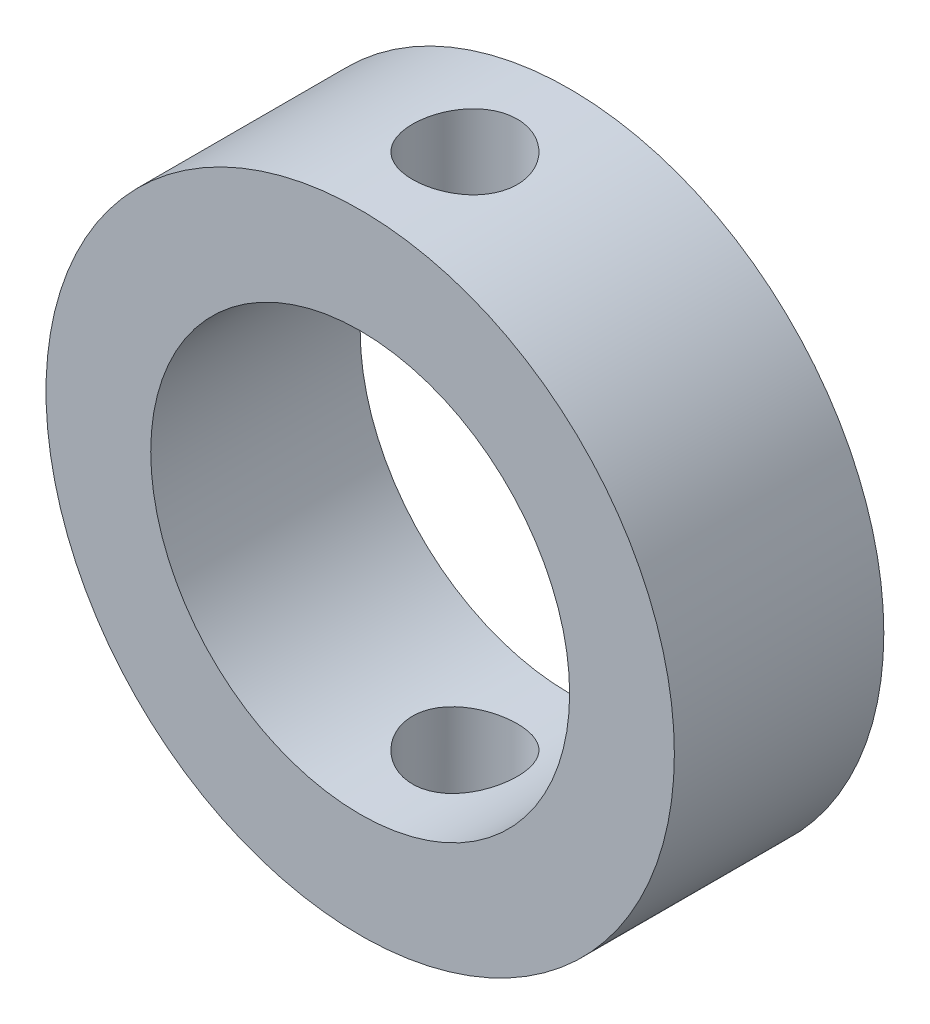
ISO-10303-21;
HEADER;
FILE_DESCRIPTION(('STEP AP214'),'2;1');
FILE_NAME('part.step','',(''),(''),'','','');
FILE_SCHEMA(('AUTOMOTIVE_DESIGN { 1 0 10303 214 1 1 1 1 }'));
ENDSEC;
DATA;
#1=APPLICATION_CONTEXT('core data for automotive mechanical design processes');
#2=APPLICATION_PROTOCOL_DEFINITION('international standard','automotive_design',2000,#1);
#3=PRODUCT_CONTEXT('',#1,'mechanical');
#4=PRODUCT('Part','Part','',(#3));
#5=PRODUCT_RELATED_PRODUCT_CATEGORY('part','',(#4));
#6=PRODUCT_DEFINITION_FORMATION('','',#4);
#7=PRODUCT_DEFINITION_CONTEXT('part definition',#1,'design');
#8=PRODUCT_DEFINITION('design','',#6,#7);
#9=PRODUCT_DEFINITION_SHAPE('','',#8);
#10=(LENGTH_UNIT() NAMED_UNIT(*) SI_UNIT(.MILLI.,.METRE.));
#11=(NAMED_UNIT(*) PLANE_ANGLE_UNIT() SI_UNIT($,.RADIAN.));
#12=(NAMED_UNIT(*) SI_UNIT($,.STERADIAN.) SOLID_ANGLE_UNIT());
#13=UNCERTAINTY_MEASURE_WITH_UNIT(LENGTH_MEASURE(1.E-05),#10,'distance_accuracy_value','');
#14=(GEOMETRIC_REPRESENTATION_CONTEXT(3) GLOBAL_UNCERTAINTY_ASSIGNED_CONTEXT((#13)) GLOBAL_UNIT_ASSIGNED_CONTEXT((#10,
#11,#12)) REPRESENTATION_CONTEXT('',''));
#15=CARTESIAN_POINT('',(0.,0.,0.));
#16=DIRECTION('',(0.,0.,1.));
#17=DIRECTION('',(1.,0.,0.));
#18=AXIS2_PLACEMENT_3D('',#15,#16,#17);
#19=CARTESIAN_POINT('',(0.,1.15989379628536,10.));
#20=DIRECTION('',(0.,0.,-1.));
#21=DIRECTION('',(-1.,0.,0.));
#22=AXIS2_PLACEMENT_3D('',#19,#20,#21);
#23=CYLINDRICAL_SURFACE('',#22,15.);
#24=CARTESIAN_POINT('',(0.,1.15989379628536,10.));
#25=DIRECTION('',(0.,0.,1.));
#26=DIRECTION('',(1.,0.,0.));
#27=AXIS2_PLACEMENT_3D('',#24,#25,#26);
#28=CIRCLE('',#27,15.);
#29=CARTESIAN_POINT('',(15.,1.15989379628536,10.));
#30=VERTEX_POINT('',#29);
#31=EDGE_CURVE('E10',#30,#30,#28,.T.);
#32=ORIENTED_EDGE('',*,*,#31,.F.);
#33=EDGE_LOOP('',(#32));
#34=FACE_BOUND('',#33,.T.);
#35=CARTESIAN_POINT('',(0.,1.15989379628536,0.));
#36=DIRECTION('',(0.,0.,1.));
#37=DIRECTION('',(1.,0.,0.));
#38=AXIS2_PLACEMENT_3D('',#35,#36,#37);
#39=CIRCLE('',#38,15.);
#40=CARTESIAN_POINT('',(15.,1.15989379628536,0.));
#41=VERTEX_POINT('',#40);
#42=EDGE_CURVE('E43',#41,#41,#39,.T.);
#43=ORIENTED_EDGE('',*,*,#42,.T.);
#44=EDGE_LOOP('',(#43));
#45=FACE_BOUND('',#44,.T.);
#46=CARTESIAN_POINT('',(0.,-13.8401062037146,2.5));
#47=CARTESIAN_POINT('',(0.139390904958215,-13.8401038154029,2.50000558894782));
#48=CARTESIAN_POINT('',(0.278857881838821,-13.838142982845,2.51169727496892));
#49=CARTESIAN_POINT('',(0.553880221673043,-13.8305096531285,2.55813565876532));
#50=CARTESIAN_POINT('',(0.689431867959247,-13.8248337429535,2.5929035569116));
#51=CARTESIAN_POINT('',(0.952604747212644,-13.8104068860791,2.68441544859275));
#52=CARTESIAN_POINT('',(1.0802323684319,-13.8016584553066,2.74114146564057));
#53=CARTESIAN_POINT('',(1.32414184197794,-13.7820484745353,2.8749122920524));
#54=CARTESIAN_POINT('',(1.44042498987859,-13.771187166259,2.951954777483));
#55=CARTESIAN_POINT('',(1.65947261429168,-13.7484393782978,3.12495508382046));
#56=CARTESIAN_POINT('',(1.76211290353497,-13.7365449218632,3.22106911463613));
#57=CARTESIAN_POINT('',(1.94988849865993,-13.713132472482,3.42914796847281));
#58=CARTESIAN_POINT('',(2.03502269939097,-13.7016145033413,3.54111379145661));
#59=CARTESIAN_POINT('',(2.18586712560513,-13.6801818613124,3.77857096619706));
#60=CARTESIAN_POINT('',(2.251454552861,-13.670277494631,3.90414133680476));
#61=CARTESIAN_POINT('',(2.36055836541122,-13.6533041016614,4.16470956430063));
#62=CARTESIAN_POINT('',(2.40407624156561,-13.6462348838577,4.29970678367763));
#63=CARTESIAN_POINT('',(2.46741437778481,-13.6358115721422,4.57398027485654));
#64=CARTESIAN_POINT('',(2.4874490291354,-13.6324238885716,4.71320573650139));
#65=CARTESIAN_POINT('',(2.50391672528988,-13.6296455930811,4.99308027688347));
#66=CARTESIAN_POINT('',(2.500351440389,-13.6302546982868,5.1337292541673));
#67=CARTESIAN_POINT('',(2.46989509839615,-13.6353704923502,5.41092786127545));
#68=CARTESIAN_POINT('',(2.44324488188977,-13.6398369369038,5.54750480354523));
#69=CARTESIAN_POINT('',(2.36775314040345,-13.6521011558247,5.81422131782913));
#70=CARTESIAN_POINT('',(2.31891085431974,-13.6598990444474,5.94436066888855));
#71=CARTESIAN_POINT('',(2.20017724609391,-13.6779909970556,6.19522882344092));
#72=CARTESIAN_POINT('',(2.13018591387971,-13.6882968747879,6.31590940608123));
#73=CARTESIAN_POINT('',(1.97121201755743,-13.7102353878647,6.54390440053839));
#74=CARTESIAN_POINT('',(1.88222792065429,-13.7218681302575,6.65121773245493));
#75=CARTESIAN_POINT('',(1.68648221215905,-13.7453264825125,6.85082608580735));
#76=CARTESIAN_POINT('',(1.57951396387313,-13.7571526960312,6.94291851854008));
#77=CARTESIAN_POINT('',(1.35153524898165,-13.7795322176819,7.10787776266534));
#78=CARTESIAN_POINT('',(1.23052469190642,-13.7900855176121,7.18074445018323));
#79=CARTESIAN_POINT('',(0.977705916166711,-13.8087451326438,7.30520222713628));
#80=CARTESIAN_POINT('',(0.84588872556466,-13.8168493877891,7.35677541933126));
#81=CARTESIAN_POINT('',(0.57529834560273,-13.8296812338412,7.43699421524598));
#82=CARTESIAN_POINT('',(0.436525739179467,-13.8344091072194,7.46564173697372));
#83=CARTESIAN_POINT('',(0.157709901301622,-13.8399175021415,7.49892135846114));
#84=CARTESIAN_POINT('',(0.0177007371510096,-13.8407437338425,7.50383157180561));
#85=CARTESIAN_POINT('',(-0.261139772889889,-13.8384809479263,7.49023865557188));
#86=CARTESIAN_POINT('',(-0.39997116389204,-13.8353920809558,7.47173642686626));
#87=CARTESIAN_POINT('',(-0.671656175546764,-13.8256744730967,7.41207515066452));
#88=CARTESIAN_POINT('',(-0.80454086838538,-13.8190672517278,7.37105379160987));
#89=CARTESIAN_POINT('',(-1.06154688486044,-13.8030508482682,7.26766548180047));
#90=CARTESIAN_POINT('',(-1.18566771590972,-13.7936415088348,7.20529733236473));
#91=CARTESIAN_POINT('',(-1.42283068946896,-13.7729513667387,7.06034887530321));
#92=CARTESIAN_POINT('',(-1.53576525093715,-13.7616547625849,6.97759484383275));
#93=CARTESIAN_POINT('',(-1.74624358550269,-13.7384908776336,6.79446268461494));
#94=CARTESIAN_POINT('',(-1.84378623969658,-13.7266235554301,6.69408327672333));
#95=CARTESIAN_POINT('',(-2.021742779658,-13.7035079560731,6.47730245192858));
#96=CARTESIAN_POINT('',(-2.10196876111372,-13.6922673650857,6.36074583448559));
#97=CARTESIAN_POINT('',(-2.24170231029499,-13.6718215014935,6.11564703086146));
#98=CARTESIAN_POINT('',(-2.30121053476982,-13.6626161643748,5.98710522477251));
#99=CARTESIAN_POINT('',(-2.39753833147315,-13.6473407406917,5.72221026718787));
#100=CARTESIAN_POINT('',(-2.43445143254795,-13.6412577468253,5.58589190496951));
#101=CARTESIAN_POINT('',(-2.48483545377828,-13.6328833720673,5.30887987077824));
#102=CARTESIAN_POINT('',(-2.49830841194617,-13.6305916615419,5.16818658026795));
#103=CARTESIAN_POINT('',(-2.50137286604735,-13.6300735345548,4.88829483403759));
#104=CARTESIAN_POINT('',(-2.49126013612519,-13.6317967687711,4.74909962142471));
#105=CARTESIAN_POINT('',(-2.44807983895685,-13.6390040182519,4.47442075194923));
#106=CARTESIAN_POINT('',(-2.41501234611248,-13.6444880213268,4.33893708305813));
#107=CARTESIAN_POINT('',(-2.3269744895949,-13.6585797665318,4.07564156270739));
#108=CARTESIAN_POINT('',(-2.27202959060044,-13.6671838759113,3.94782098994397));
#109=CARTESIAN_POINT('',(-2.14182700391591,-13.6865498929367,3.70316433080515));
#110=CARTESIAN_POINT('',(-2.06656830874856,-13.6973119075986,3.58632878962786));
#111=CARTESIAN_POINT('',(-1.89681888437215,-13.7199407441709,3.36546441689224));
#112=CARTESIAN_POINT('',(-1.80211056359365,-13.7318191594777,3.26160398329973));
#113=CARTESIAN_POINT('',(-1.59660903138023,-13.755249927323,3.07114839552506));
#114=CARTESIAN_POINT('',(-1.48581211291264,-13.7668022039801,2.98455723136183));
#115=CARTESIAN_POINT('',(-1.25036916964028,-13.7883715001368,2.83055173180005));
#116=CARTESIAN_POINT('',(-1.12563278753282,-13.7983773662457,2.76327396068705));
#117=CARTESIAN_POINT('',(-0.866513069378981,-13.8156178797324,2.65073051539008));
#118=CARTESIAN_POINT('',(-0.732139494830009,-13.8228552854895,2.6054429189203));
#119=CARTESIAN_POINT('',(-0.4977033100454,-13.8321641120442,2.54799472587333));
#120=CARTESIAN_POINT('',(-0.399058830298447,-13.8351264764482,2.53002553038403));
#121=CARTESIAN_POINT('',(-0.200289310319809,-13.8390983635758,2.50602626215525));
#122=CARTESIAN_POINT('',(-0.100164295608494,-13.8401079199211,2.49999598386264));
#123=CARTESIAN_POINT('',(0.,-13.8401062037146,2.5));
#124=B_SPLINE_CURVE_WITH_KNOTS('',3,(#46,#47,#48,#49,#50,#51,#52,#53,#54,#55,#56,#57,#58,#59,
#60,#61,#62,#63,#64,#65,#66,#67,#68,#69,#70,#71,#72,#73,#74,#75,#76,#77,#78,#79,#80,#81,#82,#83,
#84,#85,#86,#87,#88,#89,#90,#91,#92,#93,#94,#95,#96,#97,#98,#99,#100,#101,#102,#103,#104,#105,
#106,#107,#108,#109,#110,#111,#112,#113,#114,#115,#116,#117,#118,#119,#120,#121,#122,#123),
.UNSPECIFIED.,.T.,.F.,(4,2,2,2,2,2,2,2,2,2,2,2,2,2,2,2,2,2,2,2,2,2,2,2,2,2,2,2,2,2,2,2,2,2,2,2,
2,2,4),(0.,0.417806584938509,0.835997545695421,1.25384686702527,1.67164841267479,
2.09302491062332,2.51442800169857,2.9384252082384,3.36239376876181,3.78246077103424,
4.20249804320886,4.61820521760409,5.03392665025381,5.45164556632557,5.86939820680574,
6.29232769911327,6.71525991635848,7.13854688915903,7.56179844521149,7.98007883491397,
8.3983431303586,8.81407807006416,9.22983635826067,9.64926825627024,10.0687306305428,
10.4925382200762,10.9163323737594,11.3383602234177,11.7603513778662,12.177079095227,
12.5938054618813,13.0100481822622,13.4263115502934,13.8475138419339,14.2688133387897,
14.693022316072,15.1168075213007,15.4170424816402,15.7172722727697),.UNSPECIFIED.);
#125=CARTESIAN_POINT('',(0.,-13.8401062037146,2.5));
#126=VERTEX_POINT('',#125);
#127=EDGE_CURVE('E71',#126,#126,#124,.T.);
#128=ORIENTED_EDGE('',*,*,#127,.F.);
#129=EDGE_LOOP('',(#128));
#130=FACE_BOUND('',#129,.T.);
#131=CARTESIAN_POINT('',(0.,16.1598937962854,2.5));
#132=CARTESIAN_POINT('',(-0.139390904958215,16.1598914079736,2.50000558894782));
#133=CARTESIAN_POINT('',(-0.278857881838821,16.1579305754157,2.51169727496892));
#134=CARTESIAN_POINT('',(-0.553880221673043,16.1502972456992,2.55813565876532));
#135=CARTESIAN_POINT('',(-0.689431867959247,16.1446213355243,2.5929035569116));
#136=CARTESIAN_POINT('',(-0.952604747212644,16.1301944786499,2.68441544859275));
#137=CARTESIAN_POINT('',(-1.0802323684319,16.1214460478773,2.74114146564057));
#138=CARTESIAN_POINT('',(-1.32414184197794,16.1018360671061,2.8749122920524));
#139=CARTESIAN_POINT('',(-1.44042498987859,16.0909747588297,2.951954777483));
#140=CARTESIAN_POINT('',(-1.65947261429168,16.0682269708685,3.12495508382046));
#141=CARTESIAN_POINT('',(-1.76211290353497,16.0563325144339,3.22106911463613));
#142=CARTESIAN_POINT('',(-1.94988849865993,16.0329200650527,3.42914796847281));
#143=CARTESIAN_POINT('',(-2.03502269939097,16.021402095912,3.54111379145661));
#144=CARTESIAN_POINT('',(-2.18586712560513,15.9999694538832,3.77857096619706));
#145=CARTESIAN_POINT('',(-2.251454552861,15.9900650872017,3.90414133680476));
#146=CARTESIAN_POINT('',(-2.36055836541122,15.9730916942321,4.16470956430063));
#147=CARTESIAN_POINT('',(-2.40407624156561,15.9660224764284,4.29970678367763));
#148=CARTESIAN_POINT('',(-2.46741437778481,15.9555991647129,4.57398027485654));
#149=CARTESIAN_POINT('',(-2.4874490291354,15.9522114811424,4.71320573650139));
#150=CARTESIAN_POINT('',(-2.50391672528988,15.9494331856519,4.99308027688347));
#151=CARTESIAN_POINT('',(-2.500351440389,15.9500422908575,5.1337292541673));
#152=CARTESIAN_POINT('',(-2.46989509839615,15.9551580849209,5.41092786127545));
#153=CARTESIAN_POINT('',(-2.44324488188977,15.9596245294745,5.54750480354523));
#154=CARTESIAN_POINT('',(-2.36775314040345,15.9718887483954,5.81422131782913));
#155=CARTESIAN_POINT('',(-2.31891085431974,15.9796866370181,5.94436066888855));
#156=CARTESIAN_POINT('',(-2.20017724609391,15.9977785896264,6.19522882344092));
#157=CARTESIAN_POINT('',(-2.13018591387971,16.0080844673586,6.31590940608123));
#158=CARTESIAN_POINT('',(-1.97121201755743,16.0300229804354,6.54390440053839));
#159=CARTESIAN_POINT('',(-1.88222792065429,16.0416557228282,6.65121773245493));
#160=CARTESIAN_POINT('',(-1.68648221215905,16.0651140750832,6.85082608580735));
#161=CARTESIAN_POINT('',(-1.57951396387313,16.0769402886019,6.94291851854008));
#162=CARTESIAN_POINT('',(-1.35153524898165,16.0993198102526,7.10787776266534));
#163=CARTESIAN_POINT('',(-1.23052469190642,16.1098731101828,7.18074445018323));
#164=CARTESIAN_POINT('',(-0.977705916166711,16.1285327252145,7.30520222713628));
#165=CARTESIAN_POINT('',(-0.84588872556466,16.1366369803598,7.35677541933126));
#166=CARTESIAN_POINT('',(-0.57529834560273,16.149468826412,7.43699421524598));
#167=CARTESIAN_POINT('',(-0.436525739179467,16.1541966997901,7.46564173697372));
#168=CARTESIAN_POINT('',(-0.157709901301623,16.1597050947122,7.49892135846114));
#169=CARTESIAN_POINT('',(-0.0177007371510106,16.1605313264132,7.50383157180561));
#170=CARTESIAN_POINT('',(0.261139772889888,16.1582685404971,7.49023865557188));
#171=CARTESIAN_POINT('',(0.399971163892039,16.1551796735265,7.47173642686626));
#172=CARTESIAN_POINT('',(0.671656175546764,16.1454620656674,7.41207515066452));
#173=CARTESIAN_POINT('',(0.80454086838538,16.1388548442985,7.37105379160987));
#174=CARTESIAN_POINT('',(1.06154688486044,16.1228384408389,7.26766548180047));
#175=CARTESIAN_POINT('',(1.18566771590972,16.1134291014056,7.20529733236473));
#176=CARTESIAN_POINT('',(1.42283068946896,16.0927389593094,7.06034887530321));
#177=CARTESIAN_POINT('',(1.53576525093715,16.0814423551556,6.97759484383275));
#178=CARTESIAN_POINT('',(1.74624358550269,16.0582784702044,6.79446268461494));
#179=CARTESIAN_POINT('',(1.84378623969658,16.0464111480008,6.69408327672333));
#180=CARTESIAN_POINT('',(2.021742779658,16.0232955486438,6.47730245192858));
#181=CARTESIAN_POINT('',(2.10196876111372,16.0120549576564,6.36074583448559));
#182=CARTESIAN_POINT('',(2.24170231029499,15.9916090940642,6.11564703086146));
#183=CARTESIAN_POINT('',(2.30121053476982,15.9824037569456,5.98710522477251));
#184=CARTESIAN_POINT('',(2.39753833147315,15.9671283332624,5.72221026718787));
#185=CARTESIAN_POINT('',(2.43445143254795,15.961045339396,5.58589190496951));
#186=CARTESIAN_POINT('',(2.48483545377828,15.952670964638,5.30887987077824));
#187=CARTESIAN_POINT('',(2.49830841194617,15.9503792541126,5.16818658026795));
#188=CARTESIAN_POINT('',(2.50137286604735,15.9498611271255,4.88829483403759));
#189=CARTESIAN_POINT('',(2.49126013612519,15.9515843613419,4.74909962142471));
#190=CARTESIAN_POINT('',(2.44807983895685,15.9587916108226,4.47442075194924));
#191=CARTESIAN_POINT('',(2.41501234611248,15.9642756138975,4.33893708305813));
#192=CARTESIAN_POINT('',(2.3269744895949,15.9783673591026,4.07564156270739));
#193=CARTESIAN_POINT('',(2.27202959060044,15.9869714684821,3.94782098994398));
#194=CARTESIAN_POINT('',(2.14182700391591,16.0063374855074,3.70316433080515));
#195=CARTESIAN_POINT('',(2.06656830874856,16.0170995001694,3.58632878962787));
#196=CARTESIAN_POINT('',(1.89681888437216,16.0397283367416,3.36546441689225));
#197=CARTESIAN_POINT('',(1.80211056359365,16.0516067520484,3.26160398329973));
#198=CARTESIAN_POINT('',(1.59660903138023,16.0750375198938,3.07114839552506));
#199=CARTESIAN_POINT('',(1.48581211291264,16.0865897965508,2.98455723136183));
#200=CARTESIAN_POINT('',(1.25036916964028,16.1081590927076,2.83055173180005));
#201=CARTESIAN_POINT('',(1.12563278753282,16.1181649588164,2.76327396068705));
#202=CARTESIAN_POINT('',(0.866513069378981,16.1354054723031,2.65073051539008));
#203=CARTESIAN_POINT('',(0.732139494830009,16.1426428780602,2.6054429189203));
#204=CARTESIAN_POINT('',(0.4977033100454,16.1519517046149,2.54799472587333));
#205=CARTESIAN_POINT('',(0.399058830298447,16.1549140690189,2.53002553038403));
#206=CARTESIAN_POINT('',(0.200289310319808,16.1588859561466,2.50602626215525));
#207=CARTESIAN_POINT('',(0.100164295608494,16.1598955124918,2.49999598386264));
#208=CARTESIAN_POINT('',(0.,16.1598937962854,2.5));
#209=B_SPLINE_CURVE_WITH_KNOTS('',3,(#131,#132,#133,#134,#135,#136,#137,#138,#139,#140,#141,
#142,#143,#144,#145,#146,#147,#148,#149,#150,#151,#152,#153,#154,#155,#156,#157,#158,#159,#160,
#161,#162,#163,#164,#165,#166,#167,#168,#169,#170,#171,#172,#173,#174,#175,#176,#177,#178,#179,
#180,#181,#182,#183,#184,#185,#186,#187,#188,#189,#190,#191,#192,#193,#194,#195,#196,#197,#198,
#199,#200,#201,#202,#203,#204,#205,#206,#207,#208),.UNSPECIFIED.,.T.,.F.,(4,2,2,2,2,2,2,2,2,2,2,
2,2,2,2,2,2,2,2,2,2,2,2,2,2,2,2,2,2,2,2,2,2,2,2,2,2,2,4),(0.,0.41780658493851,0.835997545695421,
1.25384686702527,1.67164841267479,2.09302491062332,2.51442800169857,2.9384252082384,
3.36239376876181,3.78246077103424,4.20249804320887,4.61820521760409,5.03392665025381,
5.45164556632558,5.86939820680574,6.29232769911327,6.71525991635848,7.13854688915904,
7.56179844521149,7.98007883491397,8.3983431303586,8.81407807006416,9.22983635826067,
9.64926825627024,10.0687306305428,10.4925382200762,10.9163323737594,11.3383602234177,
11.7603513778662,12.177079095227,12.5938054618813,13.0100481822622,13.4263115502934,
13.8475138419339,14.2688133387897,14.693022316072,15.1168075213007,15.4170424816402,
15.7172722727697),.UNSPECIFIED.);
#210=CARTESIAN_POINT('',(0.,16.1598937962854,2.5));
#211=VERTEX_POINT('',#210);
#212=EDGE_CURVE('E76',#211,#211,#209,.T.);
#213=ORIENTED_EDGE('',*,*,#212,.F.);
#214=EDGE_LOOP('',(#213));
#215=FACE_BOUND('',#214,.T.);
#216=ADVANCED_FACE('F30',(#34,#45,#130,#215),#23,.T.);
#217=CARTESIAN_POINT('',(0.,1.15989379628536,10.));
#218=DIRECTION('',(0.,0.,-1.));
#219=DIRECTION('',(-1.,0.,0.));
#220=AXIS2_PLACEMENT_3D('',#217,#218,#219);
#221=CYLINDRICAL_SURFACE('',#220,10.);
#222=CARTESIAN_POINT('',(0.,-8.84010620371464,2.5));
#223=CARTESIAN_POINT('',(0.138126814449552,-8.84010386818151,2.50000387623026));
#224=CARTESIAN_POINT('',(0.276296929717939,-8.83721583924508,2.51148591795631));
#225=CARTESIAN_POINT('',(0.548677206284221,-8.82597476754621,2.55704191884501));
#226=CARTESIAN_POINT('',(0.682885078117899,-8.81761862738091,2.59112868256308));
#227=CARTESIAN_POINT('',(0.943368120304295,-8.79636664258184,2.68073208910348));
#228=CARTESIAN_POINT('',(1.06965260571667,-8.78347625108228,2.73622299785878));
#229=CARTESIAN_POINT('',(1.31112021984071,-8.75452860050833,2.86696898340807));
#230=CARTESIAN_POINT('',(1.42630297391461,-8.73847123461725,2.94222472686495));
#231=CARTESIAN_POINT('',(1.64466987883486,-8.70456309690953,3.1120013160903));
#232=CARTESIAN_POINT('',(1.74759281676843,-8.68668465618341,3.20685262493177));
#233=CARTESIAN_POINT('',(1.93624821200553,-8.65133320568024,3.41242034151506));
#234=CARTESIAN_POINT('',(2.02197872824865,-8.6338602418791,3.52313853824489));
#235=CARTESIAN_POINT('',(2.17504423799829,-8.60101913201745,3.75932537789499));
#236=CARTESIAN_POINT('',(2.2420870265419,-8.58568611146149,3.88498871801455));
#237=CARTESIAN_POINT('',(2.35399484758457,-8.55926445068158,4.14624735276672));
#238=CARTESIAN_POINT('',(2.39886342573357,-8.54817513195495,4.28184105555336));
#239=CARTESIAN_POINT('',(2.46425806134127,-8.53178081532002,4.55623916366943));
#240=CARTESIAN_POINT('',(2.48525378055342,-8.52636438699816,4.69492482672999));
#241=CARTESIAN_POINT('',(2.50376962511068,-8.52159557804116,4.97394761499891));
#242=CARTESIAN_POINT('',(2.50129356969685,-8.52224221084678,5.11428446782023));
#243=CARTESIAN_POINT('',(2.47331087439951,-8.52942629566159,5.38902634624226));
#244=CARTESIAN_POINT('',(2.44836390031772,-8.53582058716954,5.52349270244222));
#245=CARTESIAN_POINT('',(2.37704031150499,-8.55355136489912,5.7862684181851));
#246=CARTESIAN_POINT('',(2.33066217011566,-8.56488820320195,5.91457733838154));
#247=CARTESIAN_POINT('',(2.21731579656197,-8.59135810214229,6.16289669375355));
#248=CARTESIAN_POINT('',(2.1501444453882,-8.60652832821157,6.28281028631595));
#249=CARTESIAN_POINT('',(1.99726046002491,-8.63893471781449,6.50986451626137));
#250=CARTESIAN_POINT('',(1.91154458134806,-8.65617124262511,6.61700291344542));
#251=CARTESIAN_POINT('',(1.72110570780203,-8.6913708793795,6.81867269282401));
#252=CARTESIAN_POINT('',(1.61591043027643,-8.70934069501466,6.91275748343558));
#253=CARTESIAN_POINT('',(1.39101986250617,-8.74353896336058,7.08203540410651));
#254=CARTESIAN_POINT('',(1.27132412951324,-8.75976736287143,7.15722795710594));
#255=CARTESIAN_POINT('',(1.02019314780232,-8.78873507195115,7.28675097704064));
#256=CARTESIAN_POINT('',(0.88871898868104,-8.80146220584342,7.34100890042405));
#257=CARTESIAN_POINT('',(0.618126680238139,-8.82190482023825,7.42652884284929));
#258=CARTESIAN_POINT('',(0.479009998584142,-8.82962125936932,7.4577952606969));
#259=CARTESIAN_POINT('',(0.200899950650045,-8.83903119157089,7.49576260926473));
#260=CARTESIAN_POINT('',(0.0619945333136835,-8.84087376218593,7.5030717101255));
#261=CARTESIAN_POINT('',(-0.215054791335847,-8.83875295062218,7.49458499657419));
#262=CARTESIAN_POINT('',(-0.353198766074327,-8.83479009107885,7.47879126200144));
#263=CARTESIAN_POINT('',(-0.622690447960817,-8.82159922250382,7.42504848601437));
#264=CARTESIAN_POINT('',(-0.754108531614582,-8.81245010681111,7.38743122753838));
#265=CARTESIAN_POINT('',(-1.00876215408753,-8.78991798095059,7.2914881932859));
#266=CARTESIAN_POINT('',(-1.13199686505442,-8.77653454321429,7.23316032614463));
#267=CARTESIAN_POINT('',(-1.36920522404972,-8.74666133581834,7.09627311854221));
#268=CARTESIAN_POINT('',(-1.48297573639294,-8.73012065982464,7.01737314600573));
#269=CARTESIAN_POINT('',(-1.69587768940552,-8.6958480235105,6.84201681867139));
#270=CARTESIAN_POINT('',(-1.79500659828875,-8.67811585793042,6.74555743397059));
#271=CARTESIAN_POINT('',(-1.97831761345414,-8.64292215303962,6.53499673192716));
#272=CARTESIAN_POINT('',(-2.06207311270184,-8.62547794008928,6.42052049500073));
#273=CARTESIAN_POINT('',(-2.20918459835604,-8.59332084341533,6.17877894255237));
#274=CARTESIAN_POINT('',(-2.27254149026901,-8.57860783846405,6.05151419504926));
#275=CARTESIAN_POINT('',(-2.37658570101223,-8.55374111566129,5.78849046265627));
#276=CARTESIAN_POINT('',(-2.41740732773931,-8.54356045747273,5.65278728614617));
#277=CARTESIAN_POINT('',(-2.47557609990489,-8.5288852707805,5.37615060357451));
#278=CARTESIAN_POINT('',(-2.49292837912652,-8.52438949875508,5.23521824829758));
#279=CARTESIAN_POINT('',(-2.50339765056083,-8.52168789073076,4.95646496023065));
#280=CARTESIAN_POINT('',(-2.49719649630131,-8.52330508259499,4.81867094145592));
#281=CARTESIAN_POINT('',(-2.46229546385366,-8.53223802043607,4.54616018555623));
#282=CARTESIAN_POINT('',(-2.43359603781098,-8.53955365189196,4.41144338664468));
#283=CARTESIAN_POINT('',(-2.35488553240495,-8.55896054844686,4.14965256822356));
#284=CARTESIAN_POINT('',(-2.30500234113404,-8.57102312432521,4.02253782459945));
#285=CARTESIAN_POINT('',(-2.18544152267504,-8.59856879912304,3.77839102881072));
#286=CARTESIAN_POINT('',(-2.11576115005696,-8.61405237239272,3.66136037802186));
#287=CARTESIAN_POINT('',(-1.95644624772858,-8.64720010810801,3.43740895166324));
#288=CARTESIAN_POINT('',(-1.86633860485376,-8.66491061757766,3.33083154429339));
#289=CARTESIAN_POINT('',(-1.66964895198289,-8.70023999115233,3.13408825867434));
#290=CARTESIAN_POINT('',(-1.56306303543524,-8.71785883249886,3.04392628314506));
#291=CARTESIAN_POINT('',(-1.33411264450432,-8.75140046450913,2.88098115239232));
#292=CARTESIAN_POINT('',(-1.21149737052731,-8.76728675981247,2.80854231054737));
#293=CARTESIAN_POINT('',(-0.95544343251746,-8.79518828663325,2.68542089509912));
#294=CARTESIAN_POINT('',(-0.8220126057279,-8.80720629037766,2.63472273225244));
#295=CARTESIAN_POINT('',(-0.57401708873912,-8.82424052980701,2.56404694945058));
#296=CARTESIAN_POINT('',(-0.460633618180115,-8.83014928792615,2.54008126157761));
#297=CARTESIAN_POINT('',(-0.231510119227139,-8.83808295758045,2.5080567606301));
#298=CARTESIAN_POINT('',(-0.115770268737694,-8.84010816122955,2.49999675115783));
#299=CARTESIAN_POINT('',(0.,-8.84010620371464,2.5));
#300=B_SPLINE_CURVE_WITH_KNOTS('',3,(#222,#223,#224,#225,#226,#227,#228,#229,#230,#231,#232,
#233,#234,#235,#236,#237,#238,#239,#240,#241,#242,#243,#244,#245,#246,#247,#248,#249,#250,#251,
#252,#253,#254,#255,#256,#257,#258,#259,#260,#261,#262,#263,#264,#265,#266,#267,#268,#269,#270,
#271,#272,#273,#274,#275,#276,#277,#278,#279,#280,#281,#282,#283,#284,#285,#286,#287,#288,#289,
#290,#291,#292,#293,#294,#295,#296,#297,#298,#299),.UNSPECIFIED.,.T.,.F.,(4,2,2,2,2,2,2,2,2,2,2,
2,2,2,2,2,2,2,2,2,2,2,2,2,2,2,2,2,2,2,2,2,2,2,2,2,2,2,4),(0.,0.41395618745315,0.828147062939833,
1.24184150381018,1.65554990028221,2.07690725728565,2.4983121596677,2.92597745909678,
3.35357435282281,3.77260491835116,4.19156730193363,4.60037495017231,5.00921172448932,
5.42217546462,5.83521151399139,6.26002501620567,6.6848514926928,7.11113715020724,
7.53734122819939,7.95263848254328,8.36789835193439,8.7770045752893,9.18615212209352,
9.60255979281121,10.0190393835223,10.4457418201299,10.8724253125471,11.2965375769764,
11.7205570543048,12.1323963400748,12.5442273493652,12.9536066760888,13.3630428023797,
13.7831596069298,14.2033761629383,14.6312030917578,15.0587227304538,15.4057040491338,
15.752659267482),.UNSPECIFIED.);
#301=CARTESIAN_POINT('',(0.,-8.84010620371464,2.5));
#302=VERTEX_POINT('',#301);
#303=EDGE_CURVE('E53',#302,#302,#300,.T.);
#304=ORIENTED_EDGE('',*,*,#303,.T.);
#305=EDGE_LOOP('',(#304));
#306=FACE_BOUND('',#305,.T.);
#307=CARTESIAN_POINT('',(0.,1.15989379628536,10.));
#308=DIRECTION('',(0.,0.,1.));
#309=DIRECTION('',(1.,0.,0.));
#310=AXIS2_PLACEMENT_3D('',#307,#308,#309);
#311=CIRCLE('',#310,10.);
#312=CARTESIAN_POINT('',(10.,1.15989379628536,10.));
#313=VERTEX_POINT('',#312);
#314=EDGE_CURVE('E48',#313,#313,#311,.T.);
#315=ORIENTED_EDGE('',*,*,#314,.T.);
#316=EDGE_LOOP('',(#315));
#317=FACE_BOUND('',#316,.T.);
#318=CARTESIAN_POINT('',(0.,1.15989379628536,0.));
#319=DIRECTION('',(0.,0.,1.));
#320=DIRECTION('',(1.,0.,0.));
#321=AXIS2_PLACEMENT_3D('',#318,#319,#320);
#322=CIRCLE('',#321,10.);
#323=CARTESIAN_POINT('',(10.,1.15989379628536,0.));
#324=VERTEX_POINT('',#323);
#325=EDGE_CURVE('E51',#324,#324,#322,.T.);
#326=ORIENTED_EDGE('',*,*,#325,.F.);
#327=EDGE_LOOP('',(#326));
#328=FACE_BOUND('',#327,.T.);
#329=CARTESIAN_POINT('',(0.,11.1598937962854,2.5));
#330=CARTESIAN_POINT('',(-0.138126814449552,11.1598914607522,2.50000387623026));
#331=CARTESIAN_POINT('',(-0.276296929717939,11.1570034318158,2.51148591795631));
#332=CARTESIAN_POINT('',(-0.548677206284221,11.1457623601169,2.55704191884501));
#333=CARTESIAN_POINT('',(-0.682885078117899,11.1374062199516,2.59112868256308));
#334=CARTESIAN_POINT('',(-0.943368120304295,11.1161542351526,2.68073208910348));
#335=CARTESIAN_POINT('',(-1.06965260571667,11.103263843653,2.73622299785878));
#336=CARTESIAN_POINT('',(-1.31112021984071,11.074316193079,2.86696898340807));
#337=CARTESIAN_POINT('',(-1.42630297391461,11.058258827188,2.94222472686495));
#338=CARTESIAN_POINT('',(-1.64466987883486,11.0243506894802,3.1120013160903));
#339=CARTESIAN_POINT('',(-1.74759281676843,11.0064722487541,3.20685262493177));
#340=CARTESIAN_POINT('',(-1.93624821200553,10.971120798251,3.41242034151506));
#341=CARTESIAN_POINT('',(-2.02197872824865,10.9536478344498,3.52313853824489));
#342=CARTESIAN_POINT('',(-2.17504423799829,10.9208067245882,3.75932537789499));
#343=CARTESIAN_POINT('',(-2.2420870265419,10.9054737040322,3.88498871801455));
#344=CARTESIAN_POINT('',(-2.35399484758457,10.8790520432523,4.14624735276672));
#345=CARTESIAN_POINT('',(-2.39886342573357,10.8679627245257,4.28184105555336));
#346=CARTESIAN_POINT('',(-2.46425806134127,10.8515684078907,4.55623916366943));
#347=CARTESIAN_POINT('',(-2.48525378055342,10.8461519795689,4.69492482672999));
#348=CARTESIAN_POINT('',(-2.50376962511068,10.8413831706119,4.97394761499891));
#349=CARTESIAN_POINT('',(-2.50129356969685,10.8420298034175,5.11428446782023));
#350=CARTESIAN_POINT('',(-2.47331087439951,10.8492138882323,5.38902634624226));
#351=CARTESIAN_POINT('',(-2.44836390031772,10.8556081797403,5.52349270244222));
#352=CARTESIAN_POINT('',(-2.37704031150499,10.8733389574698,5.7862684181851));
#353=CARTESIAN_POINT('',(-2.33066217011565,10.8846757957727,5.91457733838154));
#354=CARTESIAN_POINT('',(-2.21731579656197,10.911145694713,6.16289669375355));
#355=CARTESIAN_POINT('',(-2.1501444453882,10.9263159207823,6.28281028631595));
#356=CARTESIAN_POINT('',(-1.99726046002491,10.9587223103852,6.50986451626137));
#357=CARTESIAN_POINT('',(-1.91154458134806,10.9759588351958,6.61700291344542));
#358=CARTESIAN_POINT('',(-1.72110570780203,11.0111584719502,6.81867269282401));
#359=CARTESIAN_POINT('',(-1.61591043027643,11.0291282875854,6.91275748343558));
#360=CARTESIAN_POINT('',(-1.39101986250617,11.0633265559313,7.08203540410651));
#361=CARTESIAN_POINT('',(-1.27132412951324,11.0795549554422,7.15722795710594));
#362=CARTESIAN_POINT('',(-1.02019314780232,11.1085226645219,7.28675097704064));
#363=CARTESIAN_POINT('',(-0.88871898868104,11.1212497984141,7.34100890042405));
#364=CARTESIAN_POINT('',(-0.618126680238139,11.141692412809,7.42652884284929));
#365=CARTESIAN_POINT('',(-0.479009998584142,11.14940885194,7.4577952606969));
#366=CARTESIAN_POINT('',(-0.200899950650045,11.1588187841416,7.49576260926473));
#367=CARTESIAN_POINT('',(-0.0619945333136835,11.1606613547566,7.5030717101255));
#368=CARTESIAN_POINT('',(0.215054791335847,11.1585405431929,7.49458499657419));
#369=CARTESIAN_POINT('',(0.353198766074327,11.1545776836496,7.47879126200144));
#370=CARTESIAN_POINT('',(0.622690447960817,11.1413868150745,7.42504848601437));
#371=CARTESIAN_POINT('',(0.754108531614582,11.1322376993818,7.38743122753838));
#372=CARTESIAN_POINT('',(1.00876215408753,11.1097055735213,7.2914881932859));
#373=CARTESIAN_POINT('',(1.13199686505442,11.096322135785,7.23316032614463));
#374=CARTESIAN_POINT('',(1.36920522404972,11.0664489283891,7.09627311854221));
#375=CARTESIAN_POINT('',(1.48297573639294,11.0499082523954,7.01737314600573));
#376=CARTESIAN_POINT('',(1.69587768940552,11.0156356160812,6.84201681867139));
#377=CARTESIAN_POINT('',(1.79500659828875,10.9979034505011,6.74555743397059));
#378=CARTESIAN_POINT('',(1.97831761345414,10.9627097456103,6.53499673192716));
#379=CARTESIAN_POINT('',(2.06207311270184,10.94526553266,6.42052049500073));
#380=CARTESIAN_POINT('',(2.20918459835604,10.9131084359861,6.17877894255237));
#381=CARTESIAN_POINT('',(2.27254149026901,10.8983954310348,6.05151419504926));
#382=CARTESIAN_POINT('',(2.37658570101223,10.873528708232,5.78849046265627));
#383=CARTESIAN_POINT('',(2.41740732773931,10.8633480500434,5.65278728614617));
#384=CARTESIAN_POINT('',(2.47557609990489,10.8486728633512,5.37615060357451));
#385=CARTESIAN_POINT('',(2.49292837912652,10.8441770913258,5.23521824829758));
#386=CARTESIAN_POINT('',(2.50339765056083,10.8414754833015,4.95646496023065));
#387=CARTESIAN_POINT('',(2.49719649630131,10.8430926751657,4.81867094145592));
#388=CARTESIAN_POINT('',(2.46229546385366,10.8520256130068,4.54616018555623));
#389=CARTESIAN_POINT('',(2.43359603781098,10.8593412444627,4.41144338664468));
#390=CARTESIAN_POINT('',(2.35488553240495,10.8787481410176,4.14965256822356));
#391=CARTESIAN_POINT('',(2.30500234113404,10.8908107168959,4.02253782459945));
#392=CARTESIAN_POINT('',(2.18544152267504,10.9183563916938,3.77839102881072));
#393=CARTESIAN_POINT('',(2.11576115005696,10.9338399649634,3.66136037802186));
#394=CARTESIAN_POINT('',(1.95644624772858,10.9669877006787,3.43740895166324));
#395=CARTESIAN_POINT('',(1.86633860485376,10.9846982101484,3.33083154429339));
#396=CARTESIAN_POINT('',(1.66964895198289,11.0200275837231,3.13408825867434));
#397=CARTESIAN_POINT('',(1.56306303543524,11.0376464250696,3.04392628314506));
#398=CARTESIAN_POINT('',(1.33411264450432,11.0711880570799,2.88098115239232));
#399=CARTESIAN_POINT('',(1.21149737052731,11.0870743523832,2.80854231054737));
#400=CARTESIAN_POINT('',(0.95544343251746,11.114975879204,2.68542089509912));
#401=CARTESIAN_POINT('',(0.8220126057279,11.1269938829484,2.63472273225244));
#402=CARTESIAN_POINT('',(0.57401708873912,11.1440281223777,2.56404694945058));
#403=CARTESIAN_POINT('',(0.460633618180115,11.1499368804969,2.54008126157761));
#404=CARTESIAN_POINT('',(0.231510119227139,11.1578705501512,2.5080567606301));
#405=CARTESIAN_POINT('',(0.115770268737694,11.1598957538003,2.49999675115783));
#406=CARTESIAN_POINT('',(0.,11.1598937962854,2.5));
#407=B_SPLINE_CURVE_WITH_KNOTS('',3,(#329,#330,#331,#332,#333,#334,#335,#336,#337,#338,#339,
#340,#341,#342,#343,#344,#345,#346,#347,#348,#349,#350,#351,#352,#353,#354,#355,#356,#357,#358,
#359,#360,#361,#362,#363,#364,#365,#366,#367,#368,#369,#370,#371,#372,#373,#374,#375,#376,#377,
#378,#379,#380,#381,#382,#383,#384,#385,#386,#387,#388,#389,#390,#391,#392,#393,#394,#395,#396,
#397,#398,#399,#400,#401,#402,#403,#404,#405,#406),.UNSPECIFIED.,.T.,.F.,(4,2,2,2,2,2,2,2,2,2,2,
2,2,2,2,2,2,2,2,2,2,2,2,2,2,2,2,2,2,2,2,2,2,2,2,2,2,2,4),(0.,0.41395618745315,0.828147062939833,
1.24184150381018,1.65554990028221,2.07690725728565,2.4983121596677,2.92597745909678,
3.35357435282281,3.77260491835116,4.19156730193363,4.60037495017231,5.00921172448932,
5.42217546462,5.83521151399139,6.26002501620567,6.6848514926928,7.11113715020724,
7.53734122819939,7.95263848254328,8.36789835193439,8.7770045752893,9.18615212209352,
9.60255979281121,10.0190393835223,10.4457418201299,10.8724253125471,11.2965375769764,
11.7205570543048,12.1323963400748,12.5442273493652,12.9536066760888,13.3630428023797,
13.7831596069298,14.2033761629383,14.6312030917578,15.0587227304538,15.4057040491338,
15.752659267482),.UNSPECIFIED.);
#408=CARTESIAN_POINT('',(0.,11.1598937962854,2.5));
#409=VERTEX_POINT('',#408);
#410=EDGE_CURVE('E34',#409,#409,#407,.T.);
#411=ORIENTED_EDGE('',*,*,#410,.T.);
#412=EDGE_LOOP('',(#411));
#413=FACE_BOUND('',#412,.T.);
#414=ADVANCED_FACE('F58',(#306,#317,#328,#413),#221,.F.);
#415=CARTESIAN_POINT('',(0.,1.15989379628536,10.));
#416=DIRECTION('',(0.,0.,1.));
#417=DIRECTION('',(1.,0.,0.));
#418=AXIS2_PLACEMENT_3D('',#415,#416,#417);
#419=PLANE('',#418);
#420=ORIENTED_EDGE('',*,*,#31,.T.);
#421=EDGE_LOOP('',(#420));
#422=FACE_BOUND('',#421,.T.);
#423=ORIENTED_EDGE('',*,*,#314,.F.);
#424=EDGE_LOOP('',(#423));
#425=FACE_BOUND('',#424,.T.);
#426=ADVANCED_FACE('F91',(#422,#425),#419,.T.);
#427=CARTESIAN_POINT('',(0.,1.15989379628536,0.));
#428=DIRECTION('',(0.,0.,1.));
#429=DIRECTION('',(1.,0.,0.));
#430=AXIS2_PLACEMENT_3D('',#427,#428,#429);
#431=PLANE('',#430);
#432=ORIENTED_EDGE('',*,*,#42,.F.);
#433=EDGE_LOOP('',(#432));
#434=FACE_BOUND('',#433,.T.);
#435=ORIENTED_EDGE('',*,*,#325,.T.);
#436=EDGE_LOOP('',(#435));
#437=FACE_BOUND('',#436,.T.);
#438=ADVANCED_FACE('F87',(#434,#437),#431,.F.);
#439=CARTESIAN_POINT('',(0.,21.,5.));
#440=DIRECTION('',(0.,-1.,0.));
#441=DIRECTION('',(0.,0.,-1.));
#442=AXIS2_PLACEMENT_3D('',#439,#440,#441);
#443=CYLINDRICAL_SURFACE('',#442,2.5);
#444=ORIENTED_EDGE('',*,*,#303,.F.);
#445=EDGE_LOOP('',(#444));
#446=FACE_BOUND('',#445,.T.);
#447=ORIENTED_EDGE('',*,*,#127,.T.);
#448=EDGE_LOOP('',(#447));
#449=FACE_BOUND('',#448,.T.);
#450=ADVANCED_FACE('F64',(#446,#449),#443,.F.);
#451=ORIENTED_EDGE('',*,*,#410,.F.);
#452=EDGE_LOOP('',(#451));
#453=FACE_BOUND('',#452,.T.);
#454=ORIENTED_EDGE('',*,*,#212,.T.);
#455=EDGE_LOOP('',(#454));
#456=FACE_BOUND('',#455,.T.);
#457=ADVANCED_FACE('F61',(#453,#456),#443,.F.);
#458=CLOSED_SHELL('',(#216,#414,#426,#438,#450,#457));
#459=MANIFOLD_SOLID_BREP('B2',#458);
#460=ADVANCED_BREP_SHAPE_REPRESENTATION('',(#18,#459),#14);
#461=SHAPE_DEFINITION_REPRESENTATION(#9,#460);
ENDSEC;
END-ISO-10303-21;
